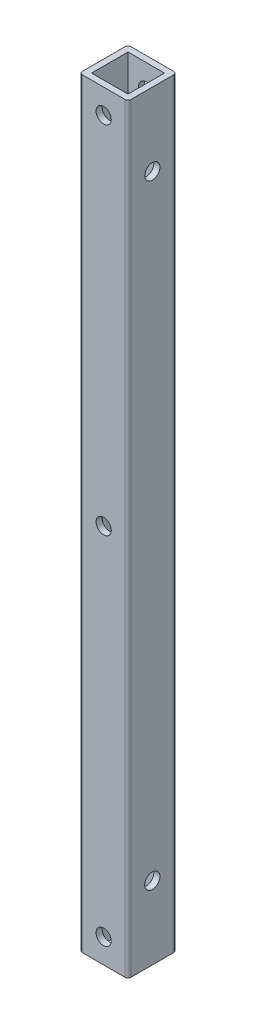
ISO-10303-21;
HEADER;
FILE_DESCRIPTION(('STEP AP214'),'2;1');
FILE_NAME('part.step','',(''),(''),'','','');
FILE_SCHEMA(('AUTOMOTIVE_DESIGN { 1 0 10303 214 1 1 1 1 }'));
ENDSEC;
DATA;
#1=APPLICATION_CONTEXT('core data for automotive mechanical design processes');
#2=APPLICATION_PROTOCOL_DEFINITION('international standard','automotive_design',2000,#1);
#3=PRODUCT_CONTEXT('',#1,'mechanical');
#4=PRODUCT('Part','Part','',(#3));
#5=PRODUCT_RELATED_PRODUCT_CATEGORY('part','',(#4));
#6=PRODUCT_DEFINITION_FORMATION('','',#4);
#7=PRODUCT_DEFINITION_CONTEXT('part definition',#1,'design');
#8=PRODUCT_DEFINITION('design','',#6,#7);
#9=PRODUCT_DEFINITION_SHAPE('','',#8);
#10=(LENGTH_UNIT() NAMED_UNIT(*) SI_UNIT(.MILLI.,.METRE.));
#11=(NAMED_UNIT(*) PLANE_ANGLE_UNIT() SI_UNIT($,.RADIAN.));
#12=(NAMED_UNIT(*) SI_UNIT($,.STERADIAN.) SOLID_ANGLE_UNIT());
#13=UNCERTAINTY_MEASURE_WITH_UNIT(LENGTH_MEASURE(1.E-05),#10,'distance_accuracy_value','');
#14=(GEOMETRIC_REPRESENTATION_CONTEXT(3) GLOBAL_UNCERTAINTY_ASSIGNED_CONTEXT((#13)) GLOBAL_UNIT_ASSIGNED_CONTEXT((#10,
#11,#12)) REPRESENTATION_CONTEXT('',''));
#15=CARTESIAN_POINT('',(0.,0.,0.));
#16=DIRECTION('',(0.,0.,1.));
#17=DIRECTION('',(1.,0.,0.));
#18=AXIS2_PLACEMENT_3D('',#15,#16,#17);
#19=CARTESIAN_POINT('',(0.,250.,0.));
#20=DIRECTION('',(0.,1.,0.));
#21=DIRECTION('',(0.,0.,1.));
#22=AXIS2_PLACEMENT_3D('',#19,#20,#21);
#23=PLANE('',#22);
#24=DIRECTION('',(0.,0.,1.));
#25=VECTOR('',#24,1.);
#26=CARTESIAN_POINT('',(-8.05905661401509,250.,-8.2247191011236));
#27=LINE('',#26,#25);
#28=CARTESIAN_POINT('',(-8.05905661401509,250.,-7.2247191011236));
#29=VERTEX_POINT('',#28);
#30=CARTESIAN_POINT('',(-8.05905661401509,250.,6.7752808988764));
#31=VERTEX_POINT('',#30);
#32=EDGE_CURVE('E197',#29,#31,#27,.T.);
#33=ORIENTED_EDGE('',*,*,#32,.T.);
#34=CARTESIAN_POINT('',(-7.05905661401509,250.,6.7752808988764));
#35=DIRECTION('',(0.,1.,0.));
#36=DIRECTION('',(0.,0.,1.));
#37=AXIS2_PLACEMENT_3D('',#34,#35,#36);
#38=CIRCLE('',#37,1.);
#39=CARTESIAN_POINT('',(-7.05905661401509,250.,7.7752808988764));
#40=VERTEX_POINT('',#39);
#41=EDGE_CURVE('E259',#31,#40,#38,.T.);
#42=ORIENTED_EDGE('',*,*,#41,.T.);
#43=DIRECTION('',(1.,0.,0.));
#44=VECTOR('',#43,1.);
#45=CARTESIAN_POINT('',(-8.05905661401509,250.,7.7752808988764));
#46=LINE('',#45,#44);
#47=CARTESIAN_POINT('',(6.94094338598491,250.,7.7752808988764));
#48=VERTEX_POINT('',#47);
#49=EDGE_CURVE('E201',#40,#48,#46,.T.);
#50=ORIENTED_EDGE('',*,*,#49,.T.);
#51=CARTESIAN_POINT('',(6.94094338598491,250.,6.7752808988764));
#52=DIRECTION('',(0.,1.,0.));
#53=DIRECTION('',(0.,0.,1.));
#54=AXIS2_PLACEMENT_3D('',#51,#52,#53);
#55=CIRCLE('',#54,1.);
#56=CARTESIAN_POINT('',(7.94094338598491,250.,6.7752808988764));
#57=VERTEX_POINT('',#56);
#58=EDGE_CURVE('E251',#48,#57,#55,.T.);
#59=ORIENTED_EDGE('',*,*,#58,.T.);
#60=DIRECTION('',(0.,0.,-1.));
#61=VECTOR('',#60,1.);
#62=CARTESIAN_POINT('',(7.94094338598491,250.,-8.2247191011236));
#63=LINE('',#62,#61);
#64=CARTESIAN_POINT('',(7.94094338598491,250.,-7.2247191011236));
#65=VERTEX_POINT('',#64);
#66=EDGE_CURVE('E206',#57,#65,#63,.T.);
#67=ORIENTED_EDGE('',*,*,#66,.T.);
#68=CARTESIAN_POINT('',(6.94094338598491,250.,-7.2247191011236));
#69=DIRECTION('',(0.,1.,0.));
#70=DIRECTION('',(0.,0.,1.));
#71=AXIS2_PLACEMENT_3D('',#68,#69,#70);
#72=CIRCLE('',#71,1.);
#73=CARTESIAN_POINT('',(6.94094338598491,250.,-8.2247191011236));
#74=VERTEX_POINT('',#73);
#75=EDGE_CURVE('E73',#65,#74,#72,.T.);
#76=ORIENTED_EDGE('',*,*,#75,.T.);
#77=DIRECTION('',(-1.,0.,0.));
#78=VECTOR('',#77,1.);
#79=CARTESIAN_POINT('',(-8.05905661401509,250.,-8.2247191011236));
#80=LINE('',#79,#78);
#81=CARTESIAN_POINT('',(-7.05905661401509,250.,-8.2247191011236));
#82=VERTEX_POINT('',#81);
#83=EDGE_CURVE('E209',#74,#82,#80,.T.);
#84=ORIENTED_EDGE('',*,*,#83,.T.);
#85=CARTESIAN_POINT('',(-7.05905661401509,250.,-7.2247191011236));
#86=DIRECTION('',(0.,1.,0.));
#87=DIRECTION('',(0.,0.,1.));
#88=AXIS2_PLACEMENT_3D('',#85,#86,#87);
#89=CIRCLE('',#88,1.);
#90=EDGE_CURVE('E256',#82,#29,#89,.T.);
#91=ORIENTED_EDGE('',*,*,#90,.T.);
#92=EDGE_LOOP('',(#33,#42,#50,#59,#67,#76,#84,#91));
#93=FACE_BOUND('',#92,.T.);
#94=DIRECTION('',(0.,0.,1.));
#95=VECTOR('',#94,1.);
#96=CARTESIAN_POINT('',(-6.05905661401509,250.,-6.2247191011236));
#97=LINE('',#96,#95);
#98=CARTESIAN_POINT('',(-6.05905661401509,250.,-6.2247191011236));
#99=VERTEX_POINT('',#98);
#100=CARTESIAN_POINT('',(-6.05905661401509,250.,5.7752808988764));
#101=VERTEX_POINT('',#100);
#102=EDGE_CURVE('E153',#99,#101,#97,.T.);
#103=ORIENTED_EDGE('',*,*,#102,.F.);
#104=DIRECTION('',(-1.,0.,0.));
#105=VECTOR('',#104,1.);
#106=CARTESIAN_POINT('',(-6.05905661401509,250.,-6.2247191011236));
#107=LINE('',#106,#105);
#108=CARTESIAN_POINT('',(5.94094338598491,250.,-6.2247191011236));
#109=VERTEX_POINT('',#108);
#110=EDGE_CURVE('E142',#109,#99,#107,.T.);
#111=ORIENTED_EDGE('',*,*,#110,.F.);
#112=DIRECTION('',(0.,0.,-1.));
#113=VECTOR('',#112,1.);
#114=CARTESIAN_POINT('',(5.94094338598491,250.,-6.2247191011236));
#115=LINE('',#114,#113);
#116=CARTESIAN_POINT('',(5.94094338598491,250.,5.7752808988764));
#117=VERTEX_POINT('',#116);
#118=EDGE_CURVE('E171',#117,#109,#115,.T.);
#119=ORIENTED_EDGE('',*,*,#118,.F.);
#120=DIRECTION('',(1.,0.,0.));
#121=VECTOR('',#120,1.);
#122=CARTESIAN_POINT('',(-6.05905661401509,250.,5.7752808988764));
#123=LINE('',#122,#121);
#124=EDGE_CURVE('E167',#101,#117,#123,.T.);
#125=ORIENTED_EDGE('',*,*,#124,.F.);
#126=EDGE_LOOP('',(#103,#111,#119,#125));
#127=FACE_BOUND('',#126,.T.);
#128=ADVANCED_FACE('F48',(#93,#127),#23,.T.);
#129=CARTESIAN_POINT('',(0.,0.,0.));
#130=DIRECTION('',(0.,1.,0.));
#131=DIRECTION('',(0.,0.,1.));
#132=AXIS2_PLACEMENT_3D('',#129,#130,#131);
#133=PLANE('',#132);
#134=DIRECTION('',(1.,0.,0.));
#135=VECTOR('',#134,1.);
#136=CARTESIAN_POINT('',(-8.05905661401509,0.,7.7752808988764));
#137=LINE('',#136,#135);
#138=CARTESIAN_POINT('',(-7.05905661401509,0.,7.7752808988764));
#139=VERTEX_POINT('',#138);
#140=CARTESIAN_POINT('',(6.94094338598491,0.,7.7752808988764));
#141=VERTEX_POINT('',#140);
#142=EDGE_CURVE('E216',#139,#141,#137,.T.);
#143=ORIENTED_EDGE('',*,*,#142,.F.);
#144=CARTESIAN_POINT('',(-7.05905661401509,0.,6.7752808988764));
#145=DIRECTION('',(0.,1.,0.));
#146=DIRECTION('',(0.,0.,1.));
#147=AXIS2_PLACEMENT_3D('',#144,#145,#146);
#148=CIRCLE('',#147,1.);
#149=CARTESIAN_POINT('',(-8.05905661401509,0.,6.7752808988764));
#150=VERTEX_POINT('',#149);
#151=EDGE_CURVE('E241',#139,#150,#148,.F.);
#152=ORIENTED_EDGE('',*,*,#151,.T.);
#153=DIRECTION('',(0.,0.,1.));
#154=VECTOR('',#153,1.);
#155=CARTESIAN_POINT('',(-8.05905661401509,0.,-8.2247191011236));
#156=LINE('',#155,#154);
#157=CARTESIAN_POINT('',(-8.05905661401509,0.,-7.2247191011236));
#158=VERTEX_POINT('',#157);
#159=EDGE_CURVE('E162',#158,#150,#156,.T.);
#160=ORIENTED_EDGE('',*,*,#159,.F.);
#161=CARTESIAN_POINT('',(-7.05905661401509,0.,-7.2247191011236));
#162=DIRECTION('',(0.,1.,0.));
#163=DIRECTION('',(0.,0.,1.));
#164=AXIS2_PLACEMENT_3D('',#161,#162,#163);
#165=CIRCLE('',#164,1.);
#166=CARTESIAN_POINT('',(-7.05905661401509,0.,-8.2247191011236));
#167=VERTEX_POINT('',#166);
#168=EDGE_CURVE('E238',#158,#167,#165,.F.);
#169=ORIENTED_EDGE('',*,*,#168,.T.);
#170=DIRECTION('',(-1.,0.,0.));
#171=VECTOR('',#170,1.);
#172=CARTESIAN_POINT('',(-8.05905661401509,0.,-8.2247191011236));
#173=LINE('',#172,#171);
#174=CARTESIAN_POINT('',(6.94094338598491,0.,-8.2247191011236));
#175=VERTEX_POINT('',#174);
#176=EDGE_CURVE('E202',#175,#167,#173,.T.);
#177=ORIENTED_EDGE('',*,*,#176,.F.);
#178=CARTESIAN_POINT('',(6.94094338598491,0.,-7.2247191011236));
#179=DIRECTION('',(0.,1.,0.));
#180=DIRECTION('',(0.,0.,1.));
#181=AXIS2_PLACEMENT_3D('',#178,#179,#180);
#182=CIRCLE('',#181,1.);
#183=CARTESIAN_POINT('',(7.94094338598491,0.,-7.2247191011236));
#184=VERTEX_POINT('',#183);
#185=EDGE_CURVE('E235',#175,#184,#182,.F.);
#186=ORIENTED_EDGE('',*,*,#185,.T.);
#187=DIRECTION('',(0.,0.,-1.));
#188=VECTOR('',#187,1.);
#189=CARTESIAN_POINT('',(7.94094338598491,0.,-8.2247191011236));
#190=LINE('',#189,#188);
#191=CARTESIAN_POINT('',(7.94094338598491,0.,6.7752808988764));
#192=VERTEX_POINT('',#191);
#193=EDGE_CURVE('E220',#192,#184,#190,.T.);
#194=ORIENTED_EDGE('',*,*,#193,.F.);
#195=CARTESIAN_POINT('',(6.94094338598491,0.,6.7752808988764));
#196=DIRECTION('',(0.,1.,0.));
#197=DIRECTION('',(0.,0.,1.));
#198=AXIS2_PLACEMENT_3D('',#195,#196,#197);
#199=CIRCLE('',#198,1.);
#200=EDGE_CURVE('E232',#192,#141,#199,.F.);
#201=ORIENTED_EDGE('',*,*,#200,.T.);
#202=EDGE_LOOP('',(#143,#152,#160,#169,#177,#186,#194,#201));
#203=FACE_BOUND('',#202,.T.);
#204=DIRECTION('',(-1.,0.,0.));
#205=VECTOR('',#204,1.);
#206=CARTESIAN_POINT('',(-6.05905661401509,0.,-6.2247191011236));
#207=LINE('',#206,#205);
#208=CARTESIAN_POINT('',(5.94094338598491,0.,-6.2247191011236));
#209=VERTEX_POINT('',#208);
#210=CARTESIAN_POINT('',(-6.05905661401509,0.,-6.2247191011236));
#211=VERTEX_POINT('',#210);
#212=EDGE_CURVE('E177',#209,#211,#207,.T.);
#213=ORIENTED_EDGE('',*,*,#212,.T.);
#214=DIRECTION('',(0.,0.,1.));
#215=VECTOR('',#214,1.);
#216=CARTESIAN_POINT('',(-6.05905661401509,0.,-6.2247191011236));
#217=LINE('',#216,#215);
#218=CARTESIAN_POINT('',(-6.05905661401509,0.,5.7752808988764));
#219=VERTEX_POINT('',#218);
#220=EDGE_CURVE('E160',#211,#219,#217,.T.);
#221=ORIENTED_EDGE('',*,*,#220,.T.);
#222=DIRECTION('',(1.,0.,0.));
#223=VECTOR('',#222,1.);
#224=CARTESIAN_POINT('',(-6.05905661401509,0.,5.7752808988764));
#225=LINE('',#224,#223);
#226=CARTESIAN_POINT('',(5.94094338598491,0.,5.7752808988764));
#227=VERTEX_POINT('',#226);
#228=EDGE_CURVE('E183',#219,#227,#225,.T.);
#229=ORIENTED_EDGE('',*,*,#228,.T.);
#230=DIRECTION('',(0.,0.,-1.));
#231=VECTOR('',#230,1.);
#232=CARTESIAN_POINT('',(5.94094338598491,0.,-6.2247191011236));
#233=LINE('',#232,#231);
#234=EDGE_CURVE('E154',#227,#209,#233,.T.);
#235=ORIENTED_EDGE('',*,*,#234,.T.);
#236=EDGE_LOOP('',(#213,#221,#229,#235));
#237=FACE_BOUND('',#236,.T.);
#238=ADVANCED_FACE('F347',(#203,#237),#133,.F.);
#239=CARTESIAN_POINT('',(-8.05905661401509,250.,-8.2247191011236));
#240=DIRECTION('',(1.,0.,0.));
#241=DIRECTION('',(0.,0.,-1.));
#242=AXIS2_PLACEMENT_3D('',#239,#240,#241);
#243=PLANE('',#242);
#244=CARTESIAN_POINT('',(-8.05905661401509,24.,-0.224719101123598));
#245=DIRECTION('',(-1.,0.,0.));
#246=DIRECTION('',(0.,0.,1.));
#247=AXIS2_PLACEMENT_3D('',#244,#245,#246);
#248=CIRCLE('',#247,2.5);
#249=CARTESIAN_POINT('',(-8.05905661401509,24.,2.2752808988764));
#250=VERTEX_POINT('',#249);
#251=EDGE_CURVE('E462',#250,#250,#248,.T.);
#252=ORIENTED_EDGE('',*,*,#251,.F.);
#253=EDGE_LOOP('',(#252));
#254=FACE_BOUND('',#253,.T.);
#255=CARTESIAN_POINT('',(-8.05905661401509,226.,-0.224719101123599));
#256=DIRECTION('',(-1.,0.,0.));
#257=DIRECTION('',(0.,0.,1.));
#258=AXIS2_PLACEMENT_3D('',#255,#256,#257);
#259=CIRCLE('',#258,2.5);
#260=CARTESIAN_POINT('',(-8.05905661401509,226.,2.2752808988764));
#261=VERTEX_POINT('',#260);
#262=EDGE_CURVE('E465',#261,#261,#259,.T.);
#263=ORIENTED_EDGE('',*,*,#262,.F.);
#264=EDGE_LOOP('',(#263));
#265=FACE_BOUND('',#264,.T.);
#266=ORIENTED_EDGE('',*,*,#159,.T.);
#267=DIRECTION('',(0.,-1.,0.));
#268=VECTOR('',#267,1.);
#269=CARTESIAN_POINT('',(-8.05905661401509,250.,6.7752808988764));
#270=LINE('',#269,#268);
#271=EDGE_CURVE('E248',#150,#31,#270,.F.);
#272=ORIENTED_EDGE('',*,*,#271,.T.);
#273=ORIENTED_EDGE('',*,*,#32,.F.);
#274=DIRECTION('',(0.,-1.,0.));
#275=VECTOR('',#274,1.);
#276=CARTESIAN_POINT('',(-8.05905661401509,250.,-7.2247191011236));
#277=LINE('',#276,#275);
#278=EDGE_CURVE('E244',#29,#158,#277,.T.);
#279=ORIENTED_EDGE('',*,*,#278,.T.);
#280=EDGE_LOOP('',(#266,#272,#273,#279));
#281=FACE_BOUND('',#280,.T.);
#282=ADVANCED_FACE('F351',(#254,#265,#281),#243,.F.);
#283=CARTESIAN_POINT('',(-8.05905661401509,250.,7.7752808988764));
#284=DIRECTION('',(0.,0.,-1.));
#285=DIRECTION('',(-1.,0.,0.));
#286=AXIS2_PLACEMENT_3D('',#283,#284,#285);
#287=PLANE('',#286);
#288=CARTESIAN_POINT('',(-0.0590566140150888,125.,7.7752808988764));
#289=DIRECTION('',(0.,0.,1.));
#290=DIRECTION('',(1.,0.,0.));
#291=AXIS2_PLACEMENT_3D('',#288,#289,#290);
#292=CIRCLE('',#291,2.5);
#293=CARTESIAN_POINT('',(2.44094338598491,125.,7.7752808988764));
#294=VERTEX_POINT('',#293);
#295=EDGE_CURVE('E447',#294,#294,#292,.T.);
#296=ORIENTED_EDGE('',*,*,#295,.F.);
#297=EDGE_LOOP('',(#296));
#298=FACE_BOUND('',#297,.T.);
#299=CARTESIAN_POINT('',(-0.0590566140150871,242.,7.7752808988764));
#300=DIRECTION('',(0.,0.,1.));
#301=DIRECTION('',(1.,0.,0.));
#302=AXIS2_PLACEMENT_3D('',#299,#300,#301);
#303=CIRCLE('',#302,2.5);
#304=CARTESIAN_POINT('',(2.44094338598492,242.,7.7752808988764));
#305=VERTEX_POINT('',#304);
#306=EDGE_CURVE('E296',#305,#305,#303,.T.);
#307=ORIENTED_EDGE('',*,*,#306,.F.);
#308=EDGE_LOOP('',(#307));
#309=FACE_BOUND('',#308,.T.);
#310=CARTESIAN_POINT('',(-0.0590566140150888,8.,7.7752808988764));
#311=DIRECTION('',(0.,0.,1.));
#312=DIRECTION('',(1.,0.,0.));
#313=AXIS2_PLACEMENT_3D('',#310,#311,#312);
#314=CIRCLE('',#313,2.5);
#315=CARTESIAN_POINT('',(2.44094338598491,8.,7.7752808988764));
#316=VERTEX_POINT('',#315);
#317=EDGE_CURVE('E315',#316,#316,#314,.T.);
#318=ORIENTED_EDGE('',*,*,#317,.F.);
#319=EDGE_LOOP('',(#318));
#320=FACE_BOUND('',#319,.T.);
#321=ORIENTED_EDGE('',*,*,#49,.F.);
#322=DIRECTION('',(0.,-1.,0.));
#323=VECTOR('',#322,1.);
#324=CARTESIAN_POINT('',(-7.05905661401509,250.,7.7752808988764));
#325=LINE('',#324,#323);
#326=EDGE_CURVE('E228',#40,#139,#325,.T.);
#327=ORIENTED_EDGE('',*,*,#326,.T.);
#328=ORIENTED_EDGE('',*,*,#142,.T.);
#329=DIRECTION('',(0.,-1.,0.));
#330=VECTOR('',#329,1.);
#331=CARTESIAN_POINT('',(6.94094338598491,250.,7.7752808988764));
#332=LINE('',#331,#330);
#333=EDGE_CURVE('E212',#141,#48,#332,.F.);
#334=ORIENTED_EDGE('',*,*,#333,.T.);
#335=EDGE_LOOP('',(#321,#327,#328,#334));
#336=FACE_BOUND('',#335,.T.);
#337=ADVANCED_FACE('F357',(#298,#309,#320,#336),#287,.F.);
#338=CARTESIAN_POINT('',(7.94094338598491,250.,-8.2247191011236));
#339=DIRECTION('',(-1.,0.,0.));
#340=DIRECTION('',(0.,0.,1.));
#341=AXIS2_PLACEMENT_3D('',#338,#339,#340);
#342=PLANE('',#341);
#343=CARTESIAN_POINT('',(7.94094338598491,24.,-0.2247191011236));
#344=DIRECTION('',(-1.,0.,0.));
#345=DIRECTION('',(0.,0.,1.));
#346=AXIS2_PLACEMENT_3D('',#343,#344,#345);
#347=CIRCLE('',#346,2.5);
#348=CARTESIAN_POINT('',(7.94094338598491,24.,2.2752808988764));
#349=VERTEX_POINT('',#348);
#350=EDGE_CURVE('E286',#349,#349,#347,.T.);
#351=ORIENTED_EDGE('',*,*,#350,.T.);
#352=EDGE_LOOP('',(#351));
#353=FACE_BOUND('',#352,.T.);
#354=CARTESIAN_POINT('',(7.94094338598491,226.,-0.224719101123601));
#355=DIRECTION('',(-1.,0.,0.));
#356=DIRECTION('',(0.,0.,1.));
#357=AXIS2_PLACEMENT_3D('',#354,#355,#356);
#358=CIRCLE('',#357,2.5);
#359=CARTESIAN_POINT('',(7.94094338598491,226.,2.2752808988764));
#360=VERTEX_POINT('',#359);
#361=EDGE_CURVE('E303',#360,#360,#358,.T.);
#362=ORIENTED_EDGE('',*,*,#361,.T.);
#363=EDGE_LOOP('',(#362));
#364=FACE_BOUND('',#363,.T.);
#365=ORIENTED_EDGE('',*,*,#193,.T.);
#366=DIRECTION('',(0.,-1.,0.));
#367=VECTOR('',#366,1.);
#368=CARTESIAN_POINT('',(7.94094338598491,250.,-7.2247191011236));
#369=LINE('',#368,#367);
#370=EDGE_CURVE('E11',#184,#65,#369,.F.);
#371=ORIENTED_EDGE('',*,*,#370,.T.);
#372=ORIENTED_EDGE('',*,*,#66,.F.);
#373=DIRECTION('',(0.,-1.,0.));
#374=VECTOR('',#373,1.);
#375=CARTESIAN_POINT('',(7.94094338598491,250.,6.7752808988764));
#376=LINE('',#375,#374);
#377=EDGE_CURVE('E58',#57,#192,#376,.T.);
#378=ORIENTED_EDGE('',*,*,#377,.T.);
#379=EDGE_LOOP('',(#365,#371,#372,#378));
#380=FACE_BOUND('',#379,.T.);
#381=ADVANCED_FACE('F340',(#353,#364,#380),#342,.F.);
#382=CARTESIAN_POINT('',(-8.05905661401509,250.,-8.2247191011236));
#383=DIRECTION('',(0.,0.,1.));
#384=DIRECTION('',(1.,0.,0.));
#385=AXIS2_PLACEMENT_3D('',#382,#383,#384);
#386=PLANE('',#385);
#387=CARTESIAN_POINT('',(-0.0590566140150888,125.,-8.2247191011236));
#388=DIRECTION('',(0.,0.,1.));
#389=DIRECTION('',(1.,0.,0.));
#390=AXIS2_PLACEMENT_3D('',#387,#388,#389);
#391=CIRCLE('',#390,2.5);
#392=CARTESIAN_POINT('',(2.44094338598491,125.,-8.2247191011236));
#393=VERTEX_POINT('',#392);
#394=EDGE_CURVE('E449',#393,#393,#391,.T.);
#395=ORIENTED_EDGE('',*,*,#394,.T.);
#396=EDGE_LOOP('',(#395));
#397=FACE_BOUND('',#396,.T.);
#398=CARTESIAN_POINT('',(-0.0590566140150871,242.,-8.2247191011236));
#399=DIRECTION('',(0.,0.,1.));
#400=DIRECTION('',(1.,0.,0.));
#401=AXIS2_PLACEMENT_3D('',#398,#399,#400);
#402=CIRCLE('',#401,2.5);
#403=CARTESIAN_POINT('',(2.44094338598492,242.,-8.2247191011236));
#404=VERTEX_POINT('',#403);
#405=EDGE_CURVE('E281',#404,#404,#402,.T.);
#406=ORIENTED_EDGE('',*,*,#405,.T.);
#407=EDGE_LOOP('',(#406));
#408=FACE_BOUND('',#407,.T.);
#409=CARTESIAN_POINT('',(-0.0590566140150888,8.,-8.2247191011236));
#410=DIRECTION('',(0.,0.,1.));
#411=DIRECTION('',(1.,0.,0.));
#412=AXIS2_PLACEMENT_3D('',#409,#410,#411);
#413=CIRCLE('',#412,2.5);
#414=CARTESIAN_POINT('',(2.44094338598491,8.,-8.2247191011236));
#415=VERTEX_POINT('',#414);
#416=EDGE_CURVE('E275',#415,#415,#413,.T.);
#417=ORIENTED_EDGE('',*,*,#416,.T.);
#418=EDGE_LOOP('',(#417));
#419=FACE_BOUND('',#418,.T.);
#420=ORIENTED_EDGE('',*,*,#176,.T.);
#421=DIRECTION('',(0.,-1.,0.));
#422=VECTOR('',#421,1.);
#423=CARTESIAN_POINT('',(-7.05905661401509,250.,-8.2247191011236));
#424=LINE('',#423,#422);
#425=EDGE_CURVE('E66',#167,#82,#424,.F.);
#426=ORIENTED_EDGE('',*,*,#425,.T.);
#427=ORIENTED_EDGE('',*,*,#83,.F.);
#428=DIRECTION('',(0.,-1.,0.));
#429=VECTOR('',#428,1.);
#430=CARTESIAN_POINT('',(6.94094338598491,250.,-8.2247191011236));
#431=LINE('',#430,#429);
#432=EDGE_CURVE('E262',#74,#175,#431,.T.);
#433=ORIENTED_EDGE('',*,*,#432,.T.);
#434=EDGE_LOOP('',(#420,#426,#427,#433));
#435=FACE_BOUND('',#434,.T.);
#436=ADVANCED_FACE('F329',(#397,#408,#419,#435),#386,.F.);
#437=CARTESIAN_POINT('',(-6.05905661401509,250.,-6.2247191011236));
#438=DIRECTION('',(0.,0.,1.));
#439=DIRECTION('',(1.,0.,0.));
#440=AXIS2_PLACEMENT_3D('',#437,#438,#439);
#441=PLANE('',#440);
#442=CARTESIAN_POINT('',(-0.0590566140150888,125.,-6.2247191011236));
#443=DIRECTION('',(0.,0.,1.));
#444=DIRECTION('',(1.,0.,0.));
#445=AXIS2_PLACEMENT_3D('',#442,#443,#444);
#446=CIRCLE('',#445,2.5);
#447=CARTESIAN_POINT('',(2.44094338598491,125.,-6.2247191011236));
#448=VERTEX_POINT('',#447);
#449=EDGE_CURVE('E455',#448,#448,#446,.T.);
#450=ORIENTED_EDGE('',*,*,#449,.F.);
#451=EDGE_LOOP('',(#450));
#452=FACE_BOUND('',#451,.T.);
#453=CARTESIAN_POINT('',(-0.0590566140150871,242.,-6.2247191011236));
#454=DIRECTION('',(0.,0.,1.));
#455=DIRECTION('',(1.,0.,0.));
#456=AXIS2_PLACEMENT_3D('',#453,#454,#455);
#457=CIRCLE('',#456,2.5);
#458=CARTESIAN_POINT('',(2.44094338598492,242.,-6.2247191011236));
#459=VERTEX_POINT('',#458);
#460=EDGE_CURVE('E280',#459,#459,#457,.T.);
#461=ORIENTED_EDGE('',*,*,#460,.F.);
#462=EDGE_LOOP('',(#461));
#463=FACE_BOUND('',#462,.T.);
#464=CARTESIAN_POINT('',(-0.0590566140150888,8.,-6.2247191011236));
#465=DIRECTION('',(0.,0.,1.));
#466=DIRECTION('',(1.,0.,0.));
#467=AXIS2_PLACEMENT_3D('',#464,#465,#466);
#468=CIRCLE('',#467,2.5);
#469=CARTESIAN_POINT('',(2.44094338598491,8.,-6.2247191011236));
#470=VERTEX_POINT('',#469);
#471=EDGE_CURVE('E180',#470,#470,#468,.T.);
#472=ORIENTED_EDGE('',*,*,#471,.F.);
#473=EDGE_LOOP('',(#472));
#474=FACE_BOUND('',#473,.T.);
#475=ORIENTED_EDGE('',*,*,#212,.F.);
#476=DIRECTION('',(0.,-1.,0.));
#477=VECTOR('',#476,1.);
#478=CARTESIAN_POINT('',(5.94094338598491,250.,-6.2247191011236));
#479=LINE('',#478,#477);
#480=EDGE_CURVE('E148',#109,#209,#479,.T.);
#481=ORIENTED_EDGE('',*,*,#480,.F.);
#482=ORIENTED_EDGE('',*,*,#110,.T.);
#483=DIRECTION('',(0.,-1.,0.));
#484=VECTOR('',#483,1.);
#485=CARTESIAN_POINT('',(-6.05905661401509,250.,-6.2247191011236));
#486=LINE('',#485,#484);
#487=EDGE_CURVE('E145',#99,#211,#486,.T.);
#488=ORIENTED_EDGE('',*,*,#487,.T.);
#489=EDGE_LOOP('',(#475,#481,#482,#488));
#490=FACE_BOUND('',#489,.T.);
#491=ADVANCED_FACE('F144',(#452,#463,#474,#490),#441,.T.);
#492=CARTESIAN_POINT('',(-6.05905661401509,250.,-6.2247191011236));
#493=DIRECTION('',(1.,0.,0.));
#494=DIRECTION('',(0.,0.,-1.));
#495=AXIS2_PLACEMENT_3D('',#492,#493,#494);
#496=PLANE('',#495);
#497=CARTESIAN_POINT('',(-6.05905661401509,24.,-0.224719101123598));
#498=DIRECTION('',(1.,0.,0.));
#499=DIRECTION('',(0.,0.,-1.));
#500=AXIS2_PLACEMENT_3D('',#497,#498,#499);
#501=CIRCLE('',#500,2.5);
#502=CARTESIAN_POINT('',(-6.05905661401509,24.,-2.7247191011236));
#503=VERTEX_POINT('',#502);
#504=EDGE_CURVE('E290',#503,#503,#501,.T.);
#505=ORIENTED_EDGE('',*,*,#504,.F.);
#506=EDGE_LOOP('',(#505));
#507=FACE_BOUND('',#506,.T.);
#508=CARTESIAN_POINT('',(-6.05905661401509,226.,-0.224719101123599));
#509=DIRECTION('',(1.,0.,0.));
#510=DIRECTION('',(0.,0.,-1.));
#511=AXIS2_PLACEMENT_3D('',#508,#509,#510);
#512=CIRCLE('',#511,2.5);
#513=CARTESIAN_POINT('',(-6.05905661401509,226.,-2.7247191011236));
#514=VERTEX_POINT('',#513);
#515=EDGE_CURVE('E285',#514,#514,#512,.T.);
#516=ORIENTED_EDGE('',*,*,#515,.F.);
#517=EDGE_LOOP('',(#516));
#518=FACE_BOUND('',#517,.T.);
#519=ORIENTED_EDGE('',*,*,#220,.F.);
#520=ORIENTED_EDGE('',*,*,#487,.F.);
#521=ORIENTED_EDGE('',*,*,#102,.T.);
#522=DIRECTION('',(0.,-1.,0.));
#523=VECTOR('',#522,1.);
#524=CARTESIAN_POINT('',(-6.05905661401509,250.,5.7752808988764));
#525=LINE('',#524,#523);
#526=EDGE_CURVE('E163',#101,#219,#525,.T.);
#527=ORIENTED_EDGE('',*,*,#526,.T.);
#528=EDGE_LOOP('',(#519,#520,#521,#527));
#529=FACE_BOUND('',#528,.T.);
#530=ADVANCED_FACE('F157',(#507,#518,#529),#496,.T.);
#531=CARTESIAN_POINT('',(-6.05905661401509,250.,5.7752808988764));
#532=DIRECTION('',(0.,0.,-1.));
#533=DIRECTION('',(-1.,0.,0.));
#534=AXIS2_PLACEMENT_3D('',#531,#532,#533);
#535=PLANE('',#534);
#536=CARTESIAN_POINT('',(-0.0590566140150888,125.,5.7752808988764));
#537=DIRECTION('',(0.,0.,-1.));
#538=DIRECTION('',(-1.,0.,0.));
#539=AXIS2_PLACEMENT_3D('',#536,#537,#538);
#540=CIRCLE('',#539,2.5);
#541=CARTESIAN_POINT('',(-2.55905661401509,125.,5.7752808988764));
#542=VERTEX_POINT('',#541);
#543=EDGE_CURVE('E52',#542,#542,#540,.T.);
#544=ORIENTED_EDGE('',*,*,#543,.F.);
#545=EDGE_LOOP('',(#544));
#546=FACE_BOUND('',#545,.T.);
#547=CARTESIAN_POINT('',(-0.0590566140150871,242.,5.7752808988764));
#548=DIRECTION('',(0.,0.,-1.));
#549=DIRECTION('',(-1.,0.,0.));
#550=AXIS2_PLACEMENT_3D('',#547,#548,#549);
#551=CIRCLE('',#550,2.5);
#552=CARTESIAN_POINT('',(-2.55905661401509,242.,5.7752808988764));
#553=VERTEX_POINT('',#552);
#554=EDGE_CURVE('E276',#553,#553,#551,.T.);
#555=ORIENTED_EDGE('',*,*,#554,.F.);
#556=EDGE_LOOP('',(#555));
#557=FACE_BOUND('',#556,.T.);
#558=CARTESIAN_POINT('',(-0.0590566140150888,8.,5.7752808988764));
#559=DIRECTION('',(0.,0.,-1.));
#560=DIRECTION('',(-1.,0.,0.));
#561=AXIS2_PLACEMENT_3D('',#558,#559,#560);
#562=CIRCLE('',#561,2.5);
#563=CARTESIAN_POINT('',(-2.55905661401509,8.,5.7752808988764));
#564=VERTEX_POINT('',#563);
#565=EDGE_CURVE('E271',#564,#564,#562,.T.);
#566=ORIENTED_EDGE('',*,*,#565,.F.);
#567=EDGE_LOOP('',(#566));
#568=FACE_BOUND('',#567,.T.);
#569=ORIENTED_EDGE('',*,*,#228,.F.);
#570=ORIENTED_EDGE('',*,*,#526,.F.);
#571=ORIENTED_EDGE('',*,*,#124,.T.);
#572=DIRECTION('',(0.,-1.,0.));
#573=VECTOR('',#572,1.);
#574=CARTESIAN_POINT('',(5.94094338598491,250.,5.7752808988764));
#575=LINE('',#574,#573);
#576=EDGE_CURVE('E192',#117,#227,#575,.T.);
#577=ORIENTED_EDGE('',*,*,#576,.T.);
#578=EDGE_LOOP('',(#569,#570,#571,#577));
#579=FACE_BOUND('',#578,.T.);
#580=ADVANCED_FACE('F337',(#546,#557,#568,#579),#535,.T.);
#581=CARTESIAN_POINT('',(5.94094338598491,250.,-6.2247191011236));
#582=DIRECTION('',(-1.,0.,0.));
#583=DIRECTION('',(0.,0.,1.));
#584=AXIS2_PLACEMENT_3D('',#581,#582,#583);
#585=PLANE('',#584);
#586=CARTESIAN_POINT('',(5.94094338598491,24.,-0.2247191011236));
#587=DIRECTION('',(-1.,0.,0.));
#588=DIRECTION('',(0.,0.,1.));
#589=AXIS2_PLACEMENT_3D('',#586,#587,#588);
#590=CIRCLE('',#589,2.5);
#591=CARTESIAN_POINT('',(5.94094338598491,24.,2.2752808988764));
#592=VERTEX_POINT('',#591);
#593=EDGE_CURVE('E287',#592,#592,#590,.T.);
#594=ORIENTED_EDGE('',*,*,#593,.F.);
#595=EDGE_LOOP('',(#594));
#596=FACE_BOUND('',#595,.T.);
#597=CARTESIAN_POINT('',(5.94094338598491,226.,-0.224719101123601));
#598=DIRECTION('',(-1.,0.,0.));
#599=DIRECTION('',(0.,0.,1.));
#600=AXIS2_PLACEMENT_3D('',#597,#598,#599);
#601=CIRCLE('',#600,2.5);
#602=CARTESIAN_POINT('',(5.94094338598491,226.,2.2752808988764));
#603=VERTEX_POINT('',#602);
#604=EDGE_CURVE('E282',#603,#603,#601,.T.);
#605=ORIENTED_EDGE('',*,*,#604,.F.);
#606=EDGE_LOOP('',(#605));
#607=FACE_BOUND('',#606,.T.);
#608=ORIENTED_EDGE('',*,*,#234,.F.);
#609=ORIENTED_EDGE('',*,*,#576,.F.);
#610=ORIENTED_EDGE('',*,*,#118,.T.);
#611=ORIENTED_EDGE('',*,*,#480,.T.);
#612=EDGE_LOOP('',(#608,#609,#610,#611));
#613=FACE_BOUND('',#612,.T.);
#614=ADVANCED_FACE('F369',(#596,#607,#613),#585,.T.);
#615=CARTESIAN_POINT('',(-7.05905661401509,250.,6.7752808988764));
#616=DIRECTION('',(0.,-1.,0.));
#617=DIRECTION('',(0.,0.,-1.));
#618=AXIS2_PLACEMENT_3D('',#615,#616,#617);
#619=CYLINDRICAL_SURFACE('',#618,1.);
#620=ORIENTED_EDGE('',*,*,#41,.F.);
#621=ORIENTED_EDGE('',*,*,#271,.F.);
#622=ORIENTED_EDGE('',*,*,#151,.F.);
#623=ORIENTED_EDGE('',*,*,#326,.F.);
#624=EDGE_LOOP('',(#620,#621,#622,#623));
#625=FACE_BOUND('',#624,.T.);
#626=ADVANCED_FACE('F365',(#625),#619,.T.);
#627=CARTESIAN_POINT('',(-7.05905661401509,250.,-7.2247191011236));
#628=DIRECTION('',(0.,-1.,0.));
#629=DIRECTION('',(0.,0.,-1.));
#630=AXIS2_PLACEMENT_3D('',#627,#628,#629);
#631=CYLINDRICAL_SURFACE('',#630,1.);
#632=ORIENTED_EDGE('',*,*,#90,.F.);
#633=ORIENTED_EDGE('',*,*,#425,.F.);
#634=ORIENTED_EDGE('',*,*,#168,.F.);
#635=ORIENTED_EDGE('',*,*,#278,.F.);
#636=EDGE_LOOP('',(#632,#633,#634,#635));
#637=FACE_BOUND('',#636,.T.);
#638=ADVANCED_FACE('F368',(#637),#631,.T.);
#639=CARTESIAN_POINT('',(6.94094338598491,250.,-7.2247191011236));
#640=DIRECTION('',(0.,-1.,0.));
#641=DIRECTION('',(0.,0.,-1.));
#642=AXIS2_PLACEMENT_3D('',#639,#640,#641);
#643=CYLINDRICAL_SURFACE('',#642,1.);
#644=ORIENTED_EDGE('',*,*,#75,.F.);
#645=ORIENTED_EDGE('',*,*,#370,.F.);
#646=ORIENTED_EDGE('',*,*,#185,.F.);
#647=ORIENTED_EDGE('',*,*,#432,.F.);
#648=EDGE_LOOP('',(#644,#645,#646,#647));
#649=FACE_BOUND('',#648,.T.);
#650=ADVANCED_FACE('F372',(#649),#643,.T.);
#651=CARTESIAN_POINT('',(6.94094338598491,250.,6.7752808988764));
#652=DIRECTION('',(0.,-1.,0.));
#653=DIRECTION('',(0.,0.,-1.));
#654=AXIS2_PLACEMENT_3D('',#651,#652,#653);
#655=CYLINDRICAL_SURFACE('',#654,1.);
#656=ORIENTED_EDGE('',*,*,#58,.F.);
#657=ORIENTED_EDGE('',*,*,#333,.F.);
#658=ORIENTED_EDGE('',*,*,#200,.F.);
#659=ORIENTED_EDGE('',*,*,#377,.F.);
#660=EDGE_LOOP('',(#656,#657,#658,#659));
#661=FACE_BOUND('',#660,.T.);
#662=ADVANCED_FACE('F50',(#661),#655,.T.);
#663=CARTESIAN_POINT('',(-0.0590566140150888,8.,-8.2247191011236));
#664=DIRECTION('',(0.,0.,1.));
#665=DIRECTION('',(1.,0.,0.));
#666=AXIS2_PLACEMENT_3D('',#663,#664,#665);
#667=CYLINDRICAL_SURFACE('',#666,2.5);
#668=ORIENTED_EDGE('',*,*,#565,.T.);
#669=EDGE_LOOP('',(#668));
#670=FACE_BOUND('',#669,.T.);
#671=ORIENTED_EDGE('',*,*,#317,.T.);
#672=EDGE_LOOP('',(#671));
#673=FACE_BOUND('',#672,.T.);
#674=ADVANCED_FACE('F379',(#670,#673),#667,.F.);
#675=ORIENTED_EDGE('',*,*,#471,.T.);
#676=EDGE_LOOP('',(#675));
#677=FACE_BOUND('',#676,.T.);
#678=ORIENTED_EDGE('',*,*,#416,.F.);
#679=EDGE_LOOP('',(#678));
#680=FACE_BOUND('',#679,.T.);
#681=ADVANCED_FACE('F325',(#677,#680),#667,.F.);
#682=CARTESIAN_POINT('',(-0.0590566140150871,242.,-8.2247191011236));
#683=DIRECTION('',(0.,0.,1.));
#684=DIRECTION('',(1.,0.,0.));
#685=AXIS2_PLACEMENT_3D('',#682,#683,#684);
#686=CYLINDRICAL_SURFACE('',#685,2.5);
#687=ORIENTED_EDGE('',*,*,#554,.T.);
#688=EDGE_LOOP('',(#687));
#689=FACE_BOUND('',#688,.T.);
#690=ORIENTED_EDGE('',*,*,#306,.T.);
#691=EDGE_LOOP('',(#690));
#692=FACE_BOUND('',#691,.T.);
#693=ADVANCED_FACE('F420',(#689,#692),#686,.F.);
#694=ORIENTED_EDGE('',*,*,#460,.T.);
#695=EDGE_LOOP('',(#694));
#696=FACE_BOUND('',#695,.T.);
#697=ORIENTED_EDGE('',*,*,#405,.F.);
#698=EDGE_LOOP('',(#697));
#699=FACE_BOUND('',#698,.T.);
#700=ADVANCED_FACE('F423',(#696,#699),#686,.F.);
#701=CARTESIAN_POINT('',(7.94094338598491,226.,-0.224719101123601));
#702=DIRECTION('',(-1.,0.,0.));
#703=DIRECTION('',(0.,0.,1.));
#704=AXIS2_PLACEMENT_3D('',#701,#702,#703);
#705=CYLINDRICAL_SURFACE('',#704,2.5);
#706=ORIENTED_EDGE('',*,*,#604,.T.);
#707=EDGE_LOOP('',(#706));
#708=FACE_BOUND('',#707,.T.);
#709=ORIENTED_EDGE('',*,*,#361,.F.);
#710=EDGE_LOOP('',(#709));
#711=FACE_BOUND('',#710,.T.);
#712=ADVANCED_FACE('F425',(#708,#711),#705,.F.);
#713=CARTESIAN_POINT('',(7.94094338598491,24.,-0.2247191011236));
#714=DIRECTION('',(-1.,0.,0.));
#715=DIRECTION('',(0.,0.,1.));
#716=AXIS2_PLACEMENT_3D('',#713,#714,#715);
#717=CYLINDRICAL_SURFACE('',#716,2.5);
#718=ORIENTED_EDGE('',*,*,#593,.T.);
#719=EDGE_LOOP('',(#718));
#720=FACE_BOUND('',#719,.T.);
#721=ORIENTED_EDGE('',*,*,#350,.F.);
#722=EDGE_LOOP('',(#721));
#723=FACE_BOUND('',#722,.T.);
#724=ADVANCED_FACE('F428',(#720,#723),#717,.F.);
#725=ORIENTED_EDGE('',*,*,#515,.T.);
#726=EDGE_LOOP('',(#725));
#727=FACE_BOUND('',#726,.T.);
#728=ORIENTED_EDGE('',*,*,#262,.T.);
#729=EDGE_LOOP('',(#728));
#730=FACE_BOUND('',#729,.T.);
#731=ADVANCED_FACE('F430',(#727,#730),#705,.F.);
#732=ORIENTED_EDGE('',*,*,#504,.T.);
#733=EDGE_LOOP('',(#732));
#734=FACE_BOUND('',#733,.T.);
#735=ORIENTED_EDGE('',*,*,#251,.T.);
#736=EDGE_LOOP('',(#735));
#737=FACE_BOUND('',#736,.T.);
#738=ADVANCED_FACE('F433',(#734,#737),#717,.F.);
#739=CARTESIAN_POINT('',(-0.0590566140150888,125.,-8.2247191011236));
#740=DIRECTION('',(0.,0.,1.));
#741=DIRECTION('',(1.,0.,0.));
#742=AXIS2_PLACEMENT_3D('',#739,#740,#741);
#743=CYLINDRICAL_SURFACE('',#742,2.5);
#744=ORIENTED_EDGE('',*,*,#543,.T.);
#745=EDGE_LOOP('',(#744));
#746=FACE_BOUND('',#745,.T.);
#747=ORIENTED_EDGE('',*,*,#295,.T.);
#748=EDGE_LOOP('',(#747));
#749=FACE_BOUND('',#748,.T.);
#750=ADVANCED_FACE('F434',(#746,#749),#743,.F.);
#751=ORIENTED_EDGE('',*,*,#449,.T.);
#752=EDGE_LOOP('',(#751));
#753=FACE_BOUND('',#752,.T.);
#754=ORIENTED_EDGE('',*,*,#394,.F.);
#755=EDGE_LOOP('',(#754));
#756=FACE_BOUND('',#755,.T.);
#757=ADVANCED_FACE('F435',(#753,#756),#743,.F.);
#758=CLOSED_SHELL('',(#128,#238,#282,#337,#381,#436,#491,#530,#580,#614,#626,#638,#650,#662,
#674,#681,#693,#700,#712,#724,#731,#738,#750,#757));
#759=MANIFOLD_SOLID_BREP('B2',#758);
#760=ADVANCED_BREP_SHAPE_REPRESENTATION('',(#18,#759),#14);
#761=SHAPE_DEFINITION_REPRESENTATION(#9,#760);
ENDSEC;
END-ISO-10303-21;
